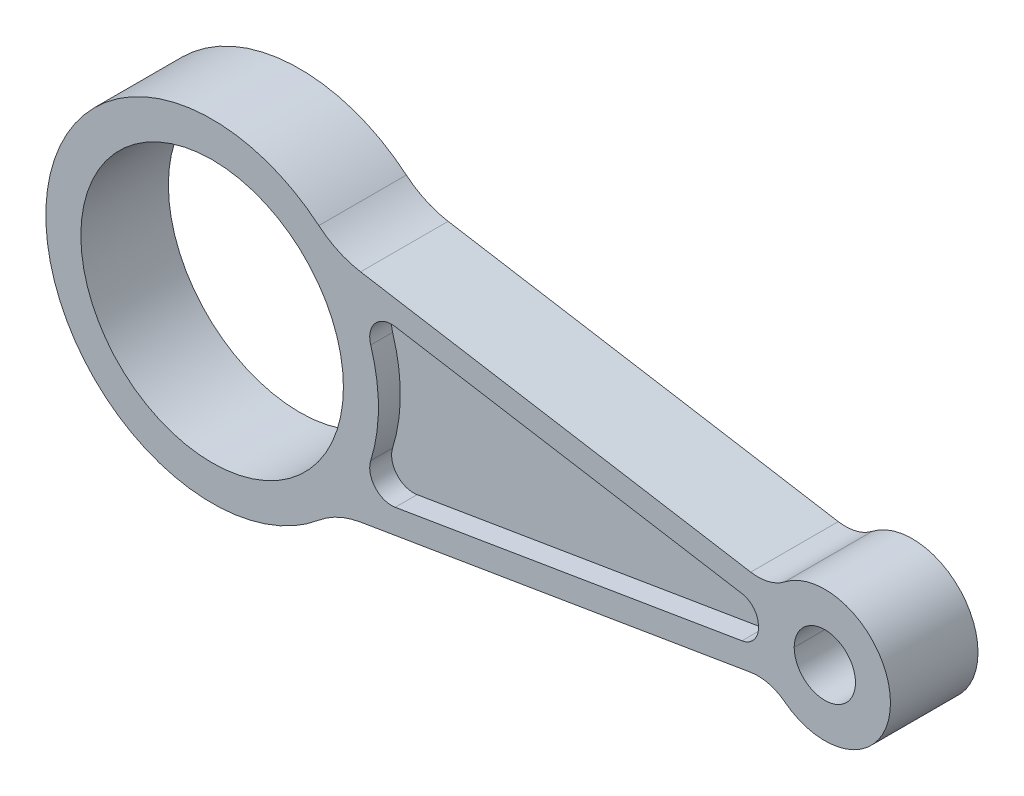
ISO-10303-21;
HEADER;
FILE_DESCRIPTION(('STEP AP214'),'2;1');
FILE_NAME('part.step','',(''),(''),'','','');
FILE_SCHEMA(('AUTOMOTIVE_DESIGN { 1 0 10303 214 1 1 1 1 }'));
ENDSEC;
DATA;
#1=APPLICATION_CONTEXT('core data for automotive mechanical design processes');
#2=APPLICATION_PROTOCOL_DEFINITION('international standard','automotive_design',2000,#1);
#3=PRODUCT_CONTEXT('',#1,'mechanical');
#4=PRODUCT('Part','Part','',(#3));
#5=PRODUCT_RELATED_PRODUCT_CATEGORY('part','',(#4));
#6=PRODUCT_DEFINITION_FORMATION('','',#4);
#7=PRODUCT_DEFINITION_CONTEXT('part definition',#1,'design');
#8=PRODUCT_DEFINITION('design','',#6,#7);
#9=PRODUCT_DEFINITION_SHAPE('','',#8);
#10=(LENGTH_UNIT() NAMED_UNIT(*) SI_UNIT(.MILLI.,.METRE.));
#11=(NAMED_UNIT(*) PLANE_ANGLE_UNIT() SI_UNIT($,.RADIAN.));
#12=(NAMED_UNIT(*) SI_UNIT($,.STERADIAN.) SOLID_ANGLE_UNIT());
#13=UNCERTAINTY_MEASURE_WITH_UNIT(LENGTH_MEASURE(1.E-05),#10,'distance_accuracy_value','');
#14=(GEOMETRIC_REPRESENTATION_CONTEXT(3) GLOBAL_UNCERTAINTY_ASSIGNED_CONTEXT((#13)) GLOBAL_UNIT_ASSIGNED_CONTEXT((#10,
#11,#12)) REPRESENTATION_CONTEXT('',''));
#15=CARTESIAN_POINT('',(0.,0.,0.));
#16=DIRECTION('',(0.,0.,1.));
#17=DIRECTION('',(1.,0.,0.));
#18=AXIS2_PLACEMENT_3D('',#15,#16,#17);
#19=CARTESIAN_POINT('',(140.,0.,-20.));
#20=DIRECTION('',(0.,0.,1.));
#21=DIRECTION('',(1.,0.,0.));
#22=AXIS2_PLACEMENT_3D('',#19,#20,#21);
#23=CYLINDRICAL_SURFACE('',#22,7.00000000000001);
#24=CARTESIAN_POINT('',(140.,0.,-20.));
#25=DIRECTION('',(0.,0.,1.));
#26=DIRECTION('',(1.,0.,0.));
#27=AXIS2_PLACEMENT_3D('',#24,#25,#26);
#28=CIRCLE('',#27,7.00000000000001);
#29=CARTESIAN_POINT('',(133.,0.,-20.));
#30=VERTEX_POINT('',#29);
#31=CARTESIAN_POINT('',(147.,0.,-20.));
#32=VERTEX_POINT('',#31);
#33=EDGE_CURVE('E326',#30,#32,#28,.T.);
#34=ORIENTED_EDGE('',*,*,#33,.F.);
#35=DIRECTION('',(0.,0.,1.));
#36=VECTOR('',#35,1.);
#37=CARTESIAN_POINT('',(133.,0.,-20.));
#38=LINE('',#37,#36);
#39=CARTESIAN_POINT('',(133.,0.,0.));
#40=VERTEX_POINT('',#39);
#41=EDGE_CURVE('E11',#30,#40,#38,.T.);
#42=ORIENTED_EDGE('',*,*,#41,.T.);
#43=CARTESIAN_POINT('',(140.,0.,0.));
#44=DIRECTION('',(0.,0.,1.));
#45=DIRECTION('',(1.,0.,0.));
#46=AXIS2_PLACEMENT_3D('',#43,#44,#45);
#47=CIRCLE('',#46,7.00000000000001);
#48=CARTESIAN_POINT('',(147.,0.,0.));
#49=VERTEX_POINT('',#48);
#50=EDGE_CURVE('E311',#40,#49,#47,.T.);
#51=ORIENTED_EDGE('',*,*,#50,.T.);
#52=DIRECTION('',(0.,0.,-1.));
#53=VECTOR('',#52,1.);
#54=CARTESIAN_POINT('',(147.,0.,-20.));
#55=LINE('',#54,#53);
#56=EDGE_CURVE('E49',#49,#32,#55,.T.);
#57=ORIENTED_EDGE('',*,*,#56,.T.);
#58=EDGE_LOOP('',(#34,#42,#51,#57));
#59=FACE_BOUND('',#58,.T.);
#60=ADVANCED_FACE('F40',(#59),#23,.F.);
#61=CARTESIAN_POINT('',(0.,0.,-20.));
#62=DIRECTION('',(0.,0.,1.));
#63=DIRECTION('',(1.,0.,0.));
#64=AXIS2_PLACEMENT_3D('',#61,#62,#63);
#65=CYLINDRICAL_SURFACE('',#64,38.);
#66=CARTESIAN_POINT('',(0.,0.,0.));
#67=DIRECTION('',(0.,0.,1.));
#68=DIRECTION('',(1.,0.,0.));
#69=AXIS2_PLACEMENT_3D('',#66,#67,#68);
#70=CIRCLE('',#69,38.);
#71=CARTESIAN_POINT('',(24.3781675337846,29.1496989297442,0.));
#72=VERTEX_POINT('',#71);
#73=CARTESIAN_POINT('',(24.3781675337846,-29.1496989297442,0.));
#74=VERTEX_POINT('',#73);
#75=EDGE_CURVE('E336',#72,#74,#70,.T.);
#76=ORIENTED_EDGE('',*,*,#75,.F.);
#77=DIRECTION('',(0.,0.,1.));
#78=VECTOR('',#77,1.);
#79=CARTESIAN_POINT('',(24.3781675337846,29.1496989297442,-20.));
#80=LINE('',#79,#78);
#81=CARTESIAN_POINT('',(24.3781675337846,29.1496989297442,-20.));
#82=VERTEX_POINT('',#81);
#83=EDGE_CURVE('E383',#72,#82,#80,.F.);
#84=ORIENTED_EDGE('',*,*,#83,.T.);
#85=CARTESIAN_POINT('',(0.,0.,-20.));
#86=DIRECTION('',(0.,0.,1.));
#87=DIRECTION('',(1.,0.,0.));
#88=AXIS2_PLACEMENT_3D('',#85,#86,#87);
#89=CIRCLE('',#88,38.);
#90=CARTESIAN_POINT('',(24.3781675337846,-29.1496989297442,-20.));
#91=VERTEX_POINT('',#90);
#92=EDGE_CURVE('E347',#82,#91,#89,.T.);
#93=ORIENTED_EDGE('',*,*,#92,.T.);
#94=DIRECTION('',(0.,0.,1.));
#95=VECTOR('',#94,1.);
#96=CARTESIAN_POINT('',(24.3781675337846,-29.1496989297442,-20.));
#97=LINE('',#96,#95);
#98=EDGE_CURVE('E380',#91,#74,#97,.T.);
#99=ORIENTED_EDGE('',*,*,#98,.T.);
#100=EDGE_LOOP('',(#76,#84,#93,#99));
#101=FACE_BOUND('',#100,.T.);
#102=ADVANCED_FACE('F42',(#101),#65,.T.);
#103=CARTESIAN_POINT('',(27.9354736759495,25.7606154914888,-20.));
#104=DIRECTION('',(0.164285714285714,0.986412795984335,0.));
#105=DIRECTION('',(-0.986412795984335,0.164285714285714,0.));
#106=AXIS2_PLACEMENT_3D('',#103,#104,#105);
#107=PLANE('',#106);
#108=DIRECTION('',(-0.986412795984335,0.164285714285714,0.));
#109=VECTOR('',#108,1.);
#110=CARTESIAN_POINT('',(27.9354736759495,25.7606154914888,-20.));
#111=LINE('',#110,#109);
#112=CARTESIAN_POINT('',(123.068754783715,9.91629645714704,-20.));
#113=VERTEX_POINT('',#112);
#114=CARTESIAN_POINT('',(33.9230677395358,24.7633898151861,-20.));
#115=VERTEX_POINT('',#114);
#116=EDGE_CURVE('E355',#113,#115,#111,.T.);
#117=ORIENTED_EDGE('',*,*,#116,.T.);
#118=DIRECTION('',(0.,0.,-1.));
#119=VECTOR('',#118,1.);
#120=CARTESIAN_POINT('',(33.9230677395358,24.7633898151861,0.));
#121=LINE('',#120,#119);
#122=CARTESIAN_POINT('',(33.9230677395358,24.7633898151861,0.));
#123=VERTEX_POINT('',#122);
#124=EDGE_CURVE('E377',#115,#123,#121,.F.);
#125=ORIENTED_EDGE('',*,*,#124,.T.);
#126=DIRECTION('',(-0.986412795984335,0.164285714285714,0.));
#127=VECTOR('',#126,1.);
#128=CARTESIAN_POINT('',(27.9354736759495,25.7606154914888,0.));
#129=LINE('',#128,#127);
#130=CARTESIAN_POINT('',(123.068754783715,9.91629645714704,0.));
#131=VERTEX_POINT('',#130);
#132=EDGE_CURVE('E344',#131,#123,#129,.T.);
#133=ORIENTED_EDGE('',*,*,#132,.F.);
#134=DIRECTION('',(0.,0.,-1.));
#135=VECTOR('',#134,1.);
#136=CARTESIAN_POINT('',(123.068754783715,9.91629645714704,-20.));
#137=LINE('',#136,#135);
#138=EDGE_CURVE('E363',#131,#113,#137,.T.);
#139=ORIENTED_EDGE('',*,*,#138,.T.);
#140=EDGE_LOOP('',(#117,#125,#133,#139));
#141=FACE_BOUND('',#140,.T.);
#142=ADVANCED_FACE('F421',(#141),#107,.T.);
#143=CARTESIAN_POINT('',(140.,0.,-20.));
#144=DIRECTION('',(0.,0.,1.));
#145=DIRECTION('',(1.,0.,0.));
#146=AXIS2_PLACEMENT_3D('',#143,#144,#145);
#147=CYLINDRICAL_SURFACE('',#146,15.);
#148=CARTESIAN_POINT('',(140.,0.,-20.));
#149=DIRECTION('',(0.,0.,1.));
#150=DIRECTION('',(1.,0.,0.));
#151=AXIS2_PLACEMENT_3D('',#148,#149,#150);
#152=CIRCLE('',#151,15.);
#153=CARTESIAN_POINT('',(130.826967155943,-11.8682546501942,-20.));
#154=VERTEX_POINT('',#153);
#155=CARTESIAN_POINT('',(130.826967155943,11.8682546501942,-20.));
#156=VERTEX_POINT('',#155);
#157=EDGE_CURVE('E352',#154,#156,#152,.T.);
#158=ORIENTED_EDGE('',*,*,#157,.T.);
#159=DIRECTION('',(0.,0.,1.));
#160=VECTOR('',#159,1.);
#161=CARTESIAN_POINT('',(130.826967155943,11.8682546501942,-20.));
#162=LINE('',#161,#160);
#163=CARTESIAN_POINT('',(130.826967155943,11.8682546501942,0.));
#164=VERTEX_POINT('',#163);
#165=EDGE_CURVE('E360',#156,#164,#162,.T.);
#166=ORIENTED_EDGE('',*,*,#165,.T.);
#167=CARTESIAN_POINT('',(140.,0.,0.));
#168=DIRECTION('',(0.,0.,1.));
#169=DIRECTION('',(1.,0.,0.));
#170=AXIS2_PLACEMENT_3D('',#167,#168,#169);
#171=CIRCLE('',#170,15.);
#172=CARTESIAN_POINT('',(130.826967155943,-11.8682546501942,0.));
#173=VERTEX_POINT('',#172);
#174=EDGE_CURVE('E341',#173,#164,#171,.T.);
#175=ORIENTED_EDGE('',*,*,#174,.F.);
#176=DIRECTION('',(0.,0.,1.));
#177=VECTOR('',#176,1.);
#178=CARTESIAN_POINT('',(130.826967155943,-11.8682546501942,-20.));
#179=LINE('',#178,#177);
#180=EDGE_CURVE('E358',#173,#154,#179,.F.);
#181=ORIENTED_EDGE('',*,*,#180,.T.);
#182=EDGE_LOOP('',(#158,#166,#175,#181));
#183=FACE_BOUND('',#182,.T.);
#184=ADVANCED_FACE('F431',(#183),#147,.T.);
#185=CARTESIAN_POINT('',(27.9354736759495,-25.7606154914888,-20.));
#186=DIRECTION('',(0.164285714285714,-0.986412795984335,0.));
#187=DIRECTION('',(0.986412795984335,0.164285714285714,0.));
#188=AXIS2_PLACEMENT_3D('',#185,#186,#187);
#189=PLANE('',#188);
#190=DIRECTION('',(0.986412795984335,0.164285714285714,0.));
#191=VECTOR('',#190,1.);
#192=CARTESIAN_POINT('',(27.9354736759495,-25.7606154914888,0.));
#193=LINE('',#192,#191);
#194=CARTESIAN_POINT('',(33.9230677395358,-24.7633898151861,0.));
#195=VERTEX_POINT('',#194);
#196=CARTESIAN_POINT('',(123.068754783715,-9.91629645714704,0.));
#197=VERTEX_POINT('',#196);
#198=EDGE_CURVE('E339',#195,#197,#193,.T.);
#199=ORIENTED_EDGE('',*,*,#198,.F.);
#200=DIRECTION('',(0.,0.,-1.));
#201=VECTOR('',#200,1.);
#202=CARTESIAN_POINT('',(33.9230677395358,-24.7633898151861,-20.));
#203=LINE('',#202,#201);
#204=CARTESIAN_POINT('',(33.9230677395358,-24.7633898151861,-20.));
#205=VERTEX_POINT('',#204);
#206=EDGE_CURVE('E385',#195,#205,#203,.T.);
#207=ORIENTED_EDGE('',*,*,#206,.T.);
#208=DIRECTION('',(0.986412795984335,0.164285714285714,0.));
#209=VECTOR('',#208,1.);
#210=CARTESIAN_POINT('',(27.9354736759495,-25.7606154914888,-20.));
#211=LINE('',#210,#209);
#212=CARTESIAN_POINT('',(123.068754783715,-9.91629645714704,-20.));
#213=VERTEX_POINT('',#212);
#214=EDGE_CURVE('E350',#205,#213,#211,.T.);
#215=ORIENTED_EDGE('',*,*,#214,.T.);
#216=DIRECTION('',(0.,0.,-1.));
#217=VECTOR('',#216,1.);
#218=CARTESIAN_POINT('',(123.068754783715,-9.91629645714704,0.));
#219=LINE('',#218,#217);
#220=EDGE_CURVE('E365',#213,#197,#219,.F.);
#221=ORIENTED_EDGE('',*,*,#220,.T.);
#222=EDGE_LOOP('',(#199,#207,#215,#221));
#223=FACE_BOUND('',#222,.T.);
#224=ADVANCED_FACE('F404',(#223),#189,.T.);
#225=CARTESIAN_POINT('',(0.,0.,-20.));
#226=DIRECTION('',(0.,0.,1.));
#227=DIRECTION('',(1.,0.,0.));
#228=AXIS2_PLACEMENT_3D('',#225,#226,#227);
#229=PLANE('',#228);
#230=DIRECTION('',(0.986412795984335,-0.164285714285714,0.));
#231=VECTOR('',#230,1.);
#232=CARTESIAN_POINT('',(121.445609230919,4.61087017438385,-20.));
#233=LINE('',#232,#231);
#234=CARTESIAN_POINT('',(41.8285545583335,17.8709827250915,-20.));
#235=VERTEX_POINT('',#234);
#236=CARTESIAN_POINT('',(121.445609230919,4.61087017438385,-20.));
#237=VERTEX_POINT('',#236);
#238=EDGE_CURVE('E215',#235,#237,#233,.T.);
#239=ORIENTED_EDGE('',*,*,#238,.F.);
#240=CARTESIAN_POINT('',(41.0071259869049,12.9389187451698,-20.));
#241=DIRECTION('',(0.,0.,-1.));
#242=DIRECTION('',(1.,0.,0.));
#243=AXIS2_PLACEMENT_3D('',#240,#241,#242);
#244=CIRCLE('',#243,5.);
#245=CARTESIAN_POINT('',(36.2388555233113,11.4343933096849,-20.));
#246=VERTEX_POINT('',#245);
#247=EDGE_CURVE('E219',#246,#235,#244,.T.);
#248=ORIENTED_EDGE('',*,*,#247,.F.);
#249=CARTESIAN_POINT('',(0.,0.,-20.));
#250=DIRECTION('',(0.,0.,1.));
#251=DIRECTION('',(-1.,0.,0.));
#252=AXIS2_PLACEMENT_3D('',#249,#250,#251);
#253=CIRCLE('',#252,38.);
#254=CARTESIAN_POINT('',(36.2388555233113,-11.4343933096849,-20.));
#255=VERTEX_POINT('',#254);
#256=EDGE_CURVE('E236',#255,#246,#253,.T.);
#257=ORIENTED_EDGE('',*,*,#256,.F.);
#258=CARTESIAN_POINT('',(41.0071259869049,-12.9389187451698,-20.));
#259=DIRECTION('',(0.,0.,-1.));
#260=DIRECTION('',(-1.,0.,0.));
#261=AXIS2_PLACEMENT_3D('',#258,#259,#260);
#262=CIRCLE('',#261,5.);
#263=CARTESIAN_POINT('',(41.8285545583335,-17.8709827250915,-20.));
#264=VERTEX_POINT('',#263);
#265=EDGE_CURVE('E233',#264,#255,#262,.T.);
#266=ORIENTED_EDGE('',*,*,#265,.F.);
#267=DIRECTION('',(-0.986412795984335,-0.164285714285714,0.));
#268=VECTOR('',#267,1.);
#269=CARTESIAN_POINT('',(121.433526351168,-4.61288256163042,-20.));
#270=LINE('',#269,#268);
#271=CARTESIAN_POINT('',(121.433526351168,-4.61288256163042,-20.));
#272=VERTEX_POINT('',#271);
#273=EDGE_CURVE('E227',#272,#264,#270,.T.);
#274=ORIENTED_EDGE('',*,*,#273,.F.);
#275=CARTESIAN_POINT('',(120.694240636883,-0.174024979700915,-20.));
#276=DIRECTION('',(0.,0.,-1.));
#277=DIRECTION('',(-1.,0.,0.));
#278=AXIS2_PLACEMENT_3D('',#275,#276,#277);
#279=CIRCLE('',#278,4.5);
#280=CARTESIAN_POINT('',(125.194211833788,-0.157924451151643,-20.));
#281=VERTEX_POINT('',#280);
#282=EDGE_CURVE('E225',#281,#272,#279,.T.);
#283=ORIENTED_EDGE('',*,*,#282,.F.);
#284=CARTESIAN_POINT('',(120.706323516633,0.172012592454348,-20.));
#285=DIRECTION('',(0.,0.,-1.));
#286=DIRECTION('',(1.,0.,0.));
#287=AXIS2_PLACEMENT_3D('',#284,#285,#286);
#288=CIRCLE('',#287,4.5);
#289=EDGE_CURVE('E203',#237,#281,#288,.T.);
#290=ORIENTED_EDGE('',*,*,#289,.F.);
#291=EDGE_LOOP('',(#239,#248,#257,#266,#274,#283,#290));
#292=FACE_BOUND('',#291,.T.);
#293=EDGE_CURVE('E327',#32,#30,#28,.T.);
#294=ORIENTED_EDGE('',*,*,#293,.T.);
#295=ORIENTED_EDGE('',*,*,#33,.T.);
#296=EDGE_LOOP('',(#294,#295));
#297=FACE_BOUND('',#296,.T.);
#298=CARTESIAN_POINT('',(0.,0.,-20.));
#299=DIRECTION('',(0.,0.,1.));
#300=DIRECTION('',(1.,0.,0.));
#301=AXIS2_PLACEMENT_3D('',#298,#299,#300);
#302=CIRCLE('',#301,30.);
#303=CARTESIAN_POINT('',(30.,0.,-20.));
#304=VERTEX_POINT('',#303);
#305=EDGE_CURVE('E333',#304,#304,#302,.T.);
#306=ORIENTED_EDGE('',*,*,#305,.T.);
#307=EDGE_LOOP('',(#306));
#308=FACE_BOUND('',#307,.T.);
#309=ORIENTED_EDGE('',*,*,#92,.F.);
#310=CARTESIAN_POINT('',(37.2087820252501,44.4916457348728,-20.));
#311=DIRECTION('',(0.,0.,1.));
#312=DIRECTION('',(1.,0.,0.));
#313=AXIS2_PLACEMENT_3D('',#310,#311,#312);
#314=CIRCLE('',#313,20.);
#315=EDGE_CURVE('E389',#82,#115,#314,.T.);
#316=ORIENTED_EDGE('',*,*,#315,.T.);
#317=ORIENTED_EDGE('',*,*,#116,.F.);
#318=CARTESIAN_POINT('',(124.711611926572,19.7804244169904,-20.));
#319=DIRECTION('',(0.,0.,1.));
#320=DIRECTION('',(1.,0.,0.));
#321=AXIS2_PLACEMENT_3D('',#318,#319,#320);
#322=CIRCLE('',#321,10.);
#323=EDGE_CURVE('E370',#113,#156,#322,.T.);
#324=ORIENTED_EDGE('',*,*,#323,.T.);
#325=ORIENTED_EDGE('',*,*,#157,.F.);
#326=CARTESIAN_POINT('',(124.711611926572,-19.7804244169904,-20.));
#327=DIRECTION('',(0.,0.,1.));
#328=DIRECTION('',(1.,0.,0.));
#329=AXIS2_PLACEMENT_3D('',#326,#327,#328);
#330=CIRCLE('',#329,10.);
#331=EDGE_CURVE('E374',#154,#213,#330,.T.);
#332=ORIENTED_EDGE('',*,*,#331,.T.);
#333=ORIENTED_EDGE('',*,*,#214,.F.);
#334=CARTESIAN_POINT('',(37.2087820252501,-44.4916457348728,-20.));
#335=DIRECTION('',(0.,0.,1.));
#336=DIRECTION('',(1.,0.,0.));
#337=AXIS2_PLACEMENT_3D('',#334,#335,#336);
#338=CIRCLE('',#337,20.);
#339=EDGE_CURVE('E393',#205,#91,#338,.T.);
#340=ORIENTED_EDGE('',*,*,#339,.T.);
#341=EDGE_LOOP('',(#309,#316,#317,#324,#325,#332,#333,#340));
#342=FACE_BOUND('',#341,.T.);
#343=ADVANCED_FACE('F221',(#292,#297,#308,#342),#229,.F.);
#344=CARTESIAN_POINT('',(0.,0.,0.));
#345=DIRECTION('',(0.,0.,1.));
#346=DIRECTION('',(1.,0.,0.));
#347=AXIS2_PLACEMENT_3D('',#344,#345,#346);
#348=PLANE('',#347);
#349=CARTESIAN_POINT('',(41.0071259869049,12.9389187451698,0.));
#350=DIRECTION('',(0.,0.,1.));
#351=DIRECTION('',(-1.,0.,0.));
#352=AXIS2_PLACEMENT_3D('',#349,#350,#351);
#353=CIRCLE('',#352,5.);
#354=CARTESIAN_POINT('',(41.8285545583335,17.8709827250915,0.));
#355=VERTEX_POINT('',#354);
#356=CARTESIAN_POINT('',(36.2388555233113,11.4343933096849,0.));
#357=VERTEX_POINT('',#356);
#358=EDGE_CURVE('E259',#355,#357,#353,.T.);
#359=ORIENTED_EDGE('',*,*,#358,.F.);
#360=DIRECTION('',(-0.986412795984335,0.164285714285714,0.));
#361=VECTOR('',#360,1.);
#362=CARTESIAN_POINT('',(41.8285545583335,17.8709827250915,0.));
#363=LINE('',#362,#361);
#364=CARTESIAN_POINT('',(121.046940727538,4.67726787330641,0.));
#365=VERTEX_POINT('',#364);
#366=EDGE_CURVE('E284',#365,#355,#363,.T.);
#367=ORIENTED_EDGE('',*,*,#366,.F.);
#368=CARTESIAN_POINT('',(120.307655013253,0.238410291376902,0.));
#369=DIRECTION('',(0.,0.,1.));
#370=DIRECTION('',(1.,0.,0.));
#371=AXIS2_PLACEMENT_3D('',#368,#369,#370);
#372=CIRCLE('',#371,4.5);
#373=CARTESIAN_POINT('',(124.807655013251,0.238406077182834,0.));
#374=VERTEX_POINT('',#373);
#375=EDGE_CURVE('E281',#374,#365,#372,.T.);
#376=ORIENTED_EDGE('',*,*,#375,.F.);
#377=CARTESIAN_POINT('',(120.332548017383,-0.234264395276501,0.));
#378=DIRECTION('',(0.,0.,1.));
#379=DIRECTION('',(-1.,0.,0.));
#380=AXIS2_PLACEMENT_3D('',#377,#378,#379);
#381=CIRCLE('',#380,4.5);
#382=CARTESIAN_POINT('',(121.071833731668,-4.67312197720601,0.));
#383=VERTEX_POINT('',#382);
#384=EDGE_CURVE('E278',#383,#374,#381,.T.);
#385=ORIENTED_EDGE('',*,*,#384,.F.);
#386=DIRECTION('',(0.986412795984335,0.164285714285714,0.));
#387=VECTOR('',#386,1.);
#388=CARTESIAN_POINT('',(41.8285545583335,-17.8709827250915,0.));
#389=LINE('',#388,#387);
#390=CARTESIAN_POINT('',(41.8285545583335,-17.8709827250915,0.));
#391=VERTEX_POINT('',#390);
#392=EDGE_CURVE('E275',#391,#383,#389,.T.);
#393=ORIENTED_EDGE('',*,*,#392,.F.);
#394=CARTESIAN_POINT('',(41.0071259869049,-12.9389187451698,0.));
#395=DIRECTION('',(0.,0.,1.));
#396=DIRECTION('',(-1.,0.,0.));
#397=AXIS2_PLACEMENT_3D('',#394,#395,#396);
#398=CIRCLE('',#397,5.);
#399=CARTESIAN_POINT('',(36.2388555233113,-11.4343933096849,0.));
#400=VERTEX_POINT('',#399);
#401=EDGE_CURVE('E272',#400,#391,#398,.T.);
#402=ORIENTED_EDGE('',*,*,#401,.F.);
#403=CARTESIAN_POINT('',(0.,0.,0.));
#404=DIRECTION('',(0.,0.,-1.));
#405=DIRECTION('',(1.,0.,0.));
#406=AXIS2_PLACEMENT_3D('',#403,#404,#405);
#407=CIRCLE('',#406,38.);
#408=EDGE_CURVE('E269',#357,#400,#407,.T.);
#409=ORIENTED_EDGE('',*,*,#408,.F.);
#410=EDGE_LOOP('',(#359,#367,#376,#385,#393,#402,#409));
#411=FACE_BOUND('',#410,.T.);
#412=EDGE_CURVE('E324',#49,#40,#47,.T.);
#413=ORIENTED_EDGE('',*,*,#412,.F.);
#414=ORIENTED_EDGE('',*,*,#50,.F.);
#415=EDGE_LOOP('',(#413,#414));
#416=FACE_BOUND('',#415,.T.);
#417=CARTESIAN_POINT('',(0.,0.,0.));
#418=DIRECTION('',(0.,0.,1.));
#419=DIRECTION('',(1.,0.,0.));
#420=AXIS2_PLACEMENT_3D('',#417,#418,#419);
#421=CIRCLE('',#420,30.);
#422=CARTESIAN_POINT('',(30.,0.,0.));
#423=VERTEX_POINT('',#422);
#424=EDGE_CURVE('E330',#423,#423,#421,.T.);
#425=ORIENTED_EDGE('',*,*,#424,.F.);
#426=EDGE_LOOP('',(#425));
#427=FACE_BOUND('',#426,.T.);
#428=ORIENTED_EDGE('',*,*,#132,.T.);
#429=CARTESIAN_POINT('',(37.2087820252501,44.4916457348728,0.));
#430=DIRECTION('',(0.,0.,1.));
#431=DIRECTION('',(1.,0.,0.));
#432=AXIS2_PLACEMENT_3D('',#429,#430,#431);
#433=CIRCLE('',#432,20.);
#434=EDGE_CURVE('E387',#123,#72,#433,.F.);
#435=ORIENTED_EDGE('',*,*,#434,.T.);
#436=ORIENTED_EDGE('',*,*,#75,.T.);
#437=CARTESIAN_POINT('',(37.2087820252501,-44.4916457348728,0.));
#438=DIRECTION('',(0.,0.,1.));
#439=DIRECTION('',(1.,0.,0.));
#440=AXIS2_PLACEMENT_3D('',#437,#438,#439);
#441=CIRCLE('',#440,20.);
#442=EDGE_CURVE('E391',#74,#195,#441,.F.);
#443=ORIENTED_EDGE('',*,*,#442,.T.);
#444=ORIENTED_EDGE('',*,*,#198,.T.);
#445=CARTESIAN_POINT('',(124.711611926572,-19.7804244169904,0.));
#446=DIRECTION('',(0.,0.,1.));
#447=DIRECTION('',(1.,0.,0.));
#448=AXIS2_PLACEMENT_3D('',#445,#446,#447);
#449=CIRCLE('',#448,10.);
#450=EDGE_CURVE('E372',#197,#173,#449,.F.);
#451=ORIENTED_EDGE('',*,*,#450,.T.);
#452=ORIENTED_EDGE('',*,*,#174,.T.);
#453=CARTESIAN_POINT('',(124.711611926572,19.7804244169904,0.));
#454=DIRECTION('',(0.,0.,1.));
#455=DIRECTION('',(1.,0.,0.));
#456=AXIS2_PLACEMENT_3D('',#453,#454,#455);
#457=CIRCLE('',#456,10.);
#458=EDGE_CURVE('E368',#164,#131,#457,.F.);
#459=ORIENTED_EDGE('',*,*,#458,.T.);
#460=EDGE_LOOP('',(#428,#435,#436,#443,#444,#451,#452,#459));
#461=FACE_BOUND('',#460,.T.);
#462=ADVANCED_FACE('F403',(#411,#416,#427,#461),#348,.T.);
#463=CARTESIAN_POINT('',(0.,0.,-20.));
#464=DIRECTION('',(0.,0.,1.));
#465=DIRECTION('',(1.,0.,0.));
#466=AXIS2_PLACEMENT_3D('',#463,#464,#465);
#467=CYLINDRICAL_SURFACE('',#466,30.);
#468=ORIENTED_EDGE('',*,*,#305,.F.);
#469=EDGE_LOOP('',(#468));
#470=FACE_BOUND('',#469,.T.);
#471=ORIENTED_EDGE('',*,*,#424,.T.);
#472=EDGE_LOOP('',(#471));
#473=FACE_BOUND('',#472,.T.);
#474=ADVANCED_FACE('F456',(#470,#473),#467,.F.);
#475=ORIENTED_EDGE('',*,*,#41,.F.);
#476=ORIENTED_EDGE('',*,*,#293,.F.);
#477=ORIENTED_EDGE('',*,*,#56,.F.);
#478=ORIENTED_EDGE('',*,*,#412,.T.);
#479=EDGE_LOOP('',(#475,#476,#477,#478));
#480=FACE_BOUND('',#479,.T.);
#481=ADVANCED_FACE('F400',(#480),#23,.F.);
#482=CARTESIAN_POINT('',(124.711611926572,19.7804244169904,-20.));
#483=DIRECTION('',(0.,0.,1.));
#484=DIRECTION('',(1.,0.,0.));
#485=AXIS2_PLACEMENT_3D('',#482,#483,#484);
#486=CYLINDRICAL_SURFACE('',#485,10.);
#487=ORIENTED_EDGE('',*,*,#323,.F.);
#488=ORIENTED_EDGE('',*,*,#138,.F.);
#489=ORIENTED_EDGE('',*,*,#458,.F.);
#490=ORIENTED_EDGE('',*,*,#165,.F.);
#491=EDGE_LOOP('',(#487,#488,#489,#490));
#492=FACE_BOUND('',#491,.T.);
#493=ADVANCED_FACE('F429',(#492),#486,.F.);
#494=CARTESIAN_POINT('',(124.711611926572,-19.7804244169904,-20.));
#495=DIRECTION('',(0.,0.,1.));
#496=DIRECTION('',(1.,0.,0.));
#497=AXIS2_PLACEMENT_3D('',#494,#495,#496);
#498=CYLINDRICAL_SURFACE('',#497,10.);
#499=ORIENTED_EDGE('',*,*,#331,.F.);
#500=ORIENTED_EDGE('',*,*,#180,.F.);
#501=ORIENTED_EDGE('',*,*,#450,.F.);
#502=ORIENTED_EDGE('',*,*,#220,.F.);
#503=EDGE_LOOP('',(#499,#500,#501,#502));
#504=FACE_BOUND('',#503,.T.);
#505=ADVANCED_FACE('F437',(#504),#498,.F.);
#506=CARTESIAN_POINT('',(37.2087820252501,44.4916457348728,-20.));
#507=DIRECTION('',(0.,0.,1.));
#508=DIRECTION('',(1.,0.,0.));
#509=AXIS2_PLACEMENT_3D('',#506,#507,#508);
#510=CYLINDRICAL_SURFACE('',#509,20.);
#511=ORIENTED_EDGE('',*,*,#315,.F.);
#512=ORIENTED_EDGE('',*,*,#83,.F.);
#513=ORIENTED_EDGE('',*,*,#434,.F.);
#514=ORIENTED_EDGE('',*,*,#124,.F.);
#515=EDGE_LOOP('',(#511,#512,#513,#514));
#516=FACE_BOUND('',#515,.T.);
#517=ADVANCED_FACE('F418',(#516),#510,.F.);
#518=CARTESIAN_POINT('',(37.2087820252501,-44.4916457348728,-20.));
#519=DIRECTION('',(0.,0.,1.));
#520=DIRECTION('',(1.,0.,0.));
#521=AXIS2_PLACEMENT_3D('',#518,#519,#520);
#522=CYLINDRICAL_SURFACE('',#521,20.);
#523=ORIENTED_EDGE('',*,*,#339,.F.);
#524=ORIENTED_EDGE('',*,*,#206,.F.);
#525=ORIENTED_EDGE('',*,*,#442,.F.);
#526=ORIENTED_EDGE('',*,*,#98,.F.);
#527=EDGE_LOOP('',(#523,#524,#525,#526));
#528=FACE_BOUND('',#527,.T.);
#529=ADVANCED_FACE('F443',(#528),#522,.F.);
#530=CARTESIAN_POINT('',(41.0071259869049,12.9389187451698,-5.));
#531=DIRECTION('',(0.,0.,1.));
#532=DIRECTION('',(1.,0.,0.));
#533=AXIS2_PLACEMENT_3D('',#530,#531,#532);
#534=CYLINDRICAL_SURFACE('',#533,5.);
#535=ORIENTED_EDGE('',*,*,#358,.T.);
#536=DIRECTION('',(0.,0.,1.));
#537=VECTOR('',#536,1.);
#538=CARTESIAN_POINT('',(36.2388555233113,11.4343933096849,-5.));
#539=LINE('',#538,#537);
#540=CARTESIAN_POINT('',(36.2388555233113,11.4343933096849,-5.));
#541=VERTEX_POINT('',#540);
#542=EDGE_CURVE('E308',#541,#357,#539,.T.);
#543=ORIENTED_EDGE('',*,*,#542,.F.);
#544=CARTESIAN_POINT('',(41.0071259869049,12.9389187451698,-5.));
#545=DIRECTION('',(0.,0.,1.));
#546=DIRECTION('',(-1.,0.,0.));
#547=AXIS2_PLACEMENT_3D('',#544,#545,#546);
#548=CIRCLE('',#547,5.);
#549=CARTESIAN_POINT('',(41.8285545583335,17.8709827250915,-5.));
#550=VERTEX_POINT('',#549);
#551=EDGE_CURVE('E287',#550,#541,#548,.T.);
#552=ORIENTED_EDGE('',*,*,#551,.F.);
#553=DIRECTION('',(0.,0.,1.));
#554=VECTOR('',#553,1.);
#555=CARTESIAN_POINT('',(41.8285545583335,17.8709827250915,-5.));
#556=LINE('',#555,#554);
#557=EDGE_CURVE('E309',#550,#355,#556,.T.);
#558=ORIENTED_EDGE('',*,*,#557,.T.);
#559=EDGE_LOOP('',(#535,#543,#552,#558));
#560=FACE_BOUND('',#559,.T.);
#561=ADVANCED_FACE('F646',(#560),#534,.F.);
#562=CARTESIAN_POINT('',(41.8285545583335,17.8709827250915,-5.));
#563=DIRECTION('',(0.164285714285714,0.986412795984335,0.));
#564=DIRECTION('',(-0.986412795984335,0.164285714285714,0.));
#565=AXIS2_PLACEMENT_3D('',#562,#563,#564);
#566=PLANE('',#565);
#567=ORIENTED_EDGE('',*,*,#366,.T.);
#568=ORIENTED_EDGE('',*,*,#557,.F.);
#569=DIRECTION('',(-0.986412795984335,0.164285714285714,0.));
#570=VECTOR('',#569,1.);
#571=CARTESIAN_POINT('',(41.8285545583335,17.8709827250915,-5.));
#572=LINE('',#571,#570);
#573=CARTESIAN_POINT('',(121.046940727538,4.67726787330641,-5.));
#574=VERTEX_POINT('',#573);
#575=EDGE_CURVE('E305',#574,#550,#572,.T.);
#576=ORIENTED_EDGE('',*,*,#575,.F.);
#577=DIRECTION('',(0.,0.,1.));
#578=VECTOR('',#577,1.);
#579=CARTESIAN_POINT('',(121.046940727538,4.67726787330641,-5.));
#580=LINE('',#579,#578);
#581=EDGE_CURVE('E312',#574,#365,#580,.T.);
#582=ORIENTED_EDGE('',*,*,#581,.T.);
#583=EDGE_LOOP('',(#567,#568,#576,#582));
#584=FACE_BOUND('',#583,.T.);
#585=ADVANCED_FACE('F636',(#584),#566,.F.);
#586=CARTESIAN_POINT('',(120.307655013253,0.238410291376902,-5.));
#587=DIRECTION('',(0.,0.,1.));
#588=DIRECTION('',(1.,0.,0.));
#589=AXIS2_PLACEMENT_3D('',#586,#587,#588);
#590=CYLINDRICAL_SURFACE('',#589,4.5);
#591=ORIENTED_EDGE('',*,*,#375,.T.);
#592=ORIENTED_EDGE('',*,*,#581,.F.);
#593=CARTESIAN_POINT('',(120.307655013253,0.238410291376902,-5.));
#594=DIRECTION('',(0.,0.,1.));
#595=DIRECTION('',(1.,0.,0.));
#596=AXIS2_PLACEMENT_3D('',#593,#594,#595);
#597=CIRCLE('',#596,4.5);
#598=CARTESIAN_POINT('',(124.807655013251,0.238406077182834,-5.));
#599=VERTEX_POINT('',#598);
#600=EDGE_CURVE('E302',#599,#574,#597,.T.);
#601=ORIENTED_EDGE('',*,*,#600,.F.);
#602=DIRECTION('',(0.,0.,1.));
#603=VECTOR('',#602,1.);
#604=CARTESIAN_POINT('',(124.807655013251,0.238406077182834,-5.));
#605=LINE('',#604,#603);
#606=EDGE_CURVE('E314',#599,#374,#605,.T.);
#607=ORIENTED_EDGE('',*,*,#606,.T.);
#608=EDGE_LOOP('',(#591,#592,#601,#607));
#609=FACE_BOUND('',#608,.T.);
#610=ADVANCED_FACE('F626',(#609),#590,.F.);
#611=CARTESIAN_POINT('',(120.332548017383,-0.234264395276501,-5.));
#612=DIRECTION('',(0.,0.,1.));
#613=DIRECTION('',(1.,0.,0.));
#614=AXIS2_PLACEMENT_3D('',#611,#612,#613);
#615=CYLINDRICAL_SURFACE('',#614,4.5);
#616=ORIENTED_EDGE('',*,*,#384,.T.);
#617=ORIENTED_EDGE('',*,*,#606,.F.);
#618=CARTESIAN_POINT('',(120.332548017383,-0.234264395276501,-5.));
#619=DIRECTION('',(0.,0.,1.));
#620=DIRECTION('',(-1.,0.,0.));
#621=AXIS2_PLACEMENT_3D('',#618,#619,#620);
#622=CIRCLE('',#621,4.5);
#623=CARTESIAN_POINT('',(121.071833731668,-4.67312197720601,-5.));
#624=VERTEX_POINT('',#623);
#625=EDGE_CURVE('E299',#624,#599,#622,.T.);
#626=ORIENTED_EDGE('',*,*,#625,.F.);
#627=DIRECTION('',(0.,0.,1.));
#628=VECTOR('',#627,1.);
#629=CARTESIAN_POINT('',(121.071833731668,-4.67312197720601,-5.));
#630=LINE('',#629,#628);
#631=EDGE_CURVE('E316',#624,#383,#630,.T.);
#632=ORIENTED_EDGE('',*,*,#631,.T.);
#633=EDGE_LOOP('',(#616,#617,#626,#632));
#634=FACE_BOUND('',#633,.T.);
#635=ADVANCED_FACE('F616',(#634),#615,.F.);
#636=CARTESIAN_POINT('',(41.8285545583335,-17.8709827250915,-5.));
#637=DIRECTION('',(0.164285714285714,-0.986412795984335,0.));
#638=DIRECTION('',(0.986412795984335,0.164285714285714,0.));
#639=AXIS2_PLACEMENT_3D('',#636,#637,#638);
#640=PLANE('',#639);
#641=ORIENTED_EDGE('',*,*,#392,.T.);
#642=ORIENTED_EDGE('',*,*,#631,.F.);
#643=DIRECTION('',(0.986412795984335,0.164285714285714,0.));
#644=VECTOR('',#643,1.);
#645=CARTESIAN_POINT('',(41.8285545583335,-17.8709827250915,-5.));
#646=LINE('',#645,#644);
#647=CARTESIAN_POINT('',(41.8285545583335,-17.8709827250915,-5.));
#648=VERTEX_POINT('',#647);
#649=EDGE_CURVE('E296',#648,#624,#646,.T.);
#650=ORIENTED_EDGE('',*,*,#649,.F.);
#651=DIRECTION('',(0.,0.,1.));
#652=VECTOR('',#651,1.);
#653=CARTESIAN_POINT('',(41.8285545583335,-17.8709827250915,-5.));
#654=LINE('',#653,#652);
#655=EDGE_CURVE('E318',#648,#391,#654,.T.);
#656=ORIENTED_EDGE('',*,*,#655,.T.);
#657=EDGE_LOOP('',(#641,#642,#650,#656));
#658=FACE_BOUND('',#657,.T.);
#659=ADVANCED_FACE('F606',(#658),#640,.F.);
#660=CARTESIAN_POINT('',(41.0071259869049,-12.9389187451698,-5.));
#661=DIRECTION('',(0.,0.,1.));
#662=DIRECTION('',(1.,0.,0.));
#663=AXIS2_PLACEMENT_3D('',#660,#661,#662);
#664=CYLINDRICAL_SURFACE('',#663,5.);
#665=ORIENTED_EDGE('',*,*,#401,.T.);
#666=ORIENTED_EDGE('',*,*,#655,.F.);
#667=CARTESIAN_POINT('',(41.0071259869049,-12.9389187451698,-5.));
#668=DIRECTION('',(0.,0.,1.));
#669=DIRECTION('',(-1.,0.,0.));
#670=AXIS2_PLACEMENT_3D('',#667,#668,#669);
#671=CIRCLE('',#670,5.);
#672=CARTESIAN_POINT('',(36.2388555233113,-11.4343933096849,-5.));
#673=VERTEX_POINT('',#672);
#674=EDGE_CURVE('E293',#673,#648,#671,.T.);
#675=ORIENTED_EDGE('',*,*,#674,.F.);
#676=DIRECTION('',(0.,0.,1.));
#677=VECTOR('',#676,1.);
#678=CARTESIAN_POINT('',(36.2388555233113,-11.4343933096849,-5.));
#679=LINE('',#678,#677);
#680=EDGE_CURVE('E320',#673,#400,#679,.T.);
#681=ORIENTED_EDGE('',*,*,#680,.T.);
#682=EDGE_LOOP('',(#665,#666,#675,#681));
#683=FACE_BOUND('',#682,.T.);
#684=ADVANCED_FACE('F596',(#683),#664,.F.);
#685=CARTESIAN_POINT('',(0.,0.,-5.));
#686=DIRECTION('',(0.,0.,1.));
#687=DIRECTION('',(1.,0.,0.));
#688=AXIS2_PLACEMENT_3D('',#685,#686,#687);
#689=CYLINDRICAL_SURFACE('',#688,38.);
#690=ORIENTED_EDGE('',*,*,#408,.T.);
#691=ORIENTED_EDGE('',*,*,#680,.F.);
#692=CARTESIAN_POINT('',(0.,0.,-5.));
#693=DIRECTION('',(0.,0.,-1.));
#694=DIRECTION('',(1.,0.,0.));
#695=AXIS2_PLACEMENT_3D('',#692,#693,#694);
#696=CIRCLE('',#695,38.);
#697=EDGE_CURVE('E290',#541,#673,#696,.T.);
#698=ORIENTED_EDGE('',*,*,#697,.F.);
#699=ORIENTED_EDGE('',*,*,#542,.T.);
#700=EDGE_LOOP('',(#690,#691,#698,#699));
#701=FACE_BOUND('',#700,.T.);
#702=ADVANCED_FACE('F586',(#701),#689,.T.);
#703=CARTESIAN_POINT('',(41.0071259869049,12.9389187451698,-5.));
#704=DIRECTION('',(0.,0.,-1.));
#705=DIRECTION('',(-1.,0.,0.));
#706=AXIS2_PLACEMENT_3D('',#703,#704,#705);
#707=PLANE('',#706);
#708=ORIENTED_EDGE('',*,*,#551,.T.);
#709=ORIENTED_EDGE('',*,*,#697,.T.);
#710=ORIENTED_EDGE('',*,*,#674,.T.);
#711=ORIENTED_EDGE('',*,*,#649,.T.);
#712=ORIENTED_EDGE('',*,*,#625,.T.);
#713=ORIENTED_EDGE('',*,*,#600,.T.);
#714=ORIENTED_EDGE('',*,*,#575,.T.);
#715=EDGE_LOOP('',(#708,#709,#710,#711,#712,#713,#714));
#716=FACE_BOUND('',#715,.T.);
#717=ADVANCED_FACE('F576',(#716),#707,.F.);
#718=CARTESIAN_POINT('',(41.0071259869049,12.9389187451698,-15.));
#719=DIRECTION('',(0.,0.,-1.));
#720=DIRECTION('',(-1.,0.,0.));
#721=AXIS2_PLACEMENT_3D('',#718,#719,#720);
#722=CYLINDRICAL_SURFACE('',#721,5.);
#723=ORIENTED_EDGE('',*,*,#247,.T.);
#724=DIRECTION('',(0.,0.,-1.));
#725=VECTOR('',#724,1.);
#726=CARTESIAN_POINT('',(41.8285545583335,17.8709827250915,-15.));
#727=LINE('',#726,#725);
#728=CARTESIAN_POINT('',(41.8285545583335,17.8709827250915,-15.));
#729=VERTEX_POINT('',#728);
#730=EDGE_CURVE('E211',#729,#235,#727,.T.);
#731=ORIENTED_EDGE('',*,*,#730,.F.);
#732=CARTESIAN_POINT('',(41.0071259869049,12.9389187451698,-15.));
#733=DIRECTION('',(0.,0.,-1.));
#734=DIRECTION('',(1.,0.,0.));
#735=AXIS2_PLACEMENT_3D('',#732,#733,#734);
#736=CIRCLE('',#735,5.);
#737=CARTESIAN_POINT('',(36.2388555233113,11.4343933096849,-15.));
#738=VERTEX_POINT('',#737);
#739=EDGE_CURVE('E239',#738,#729,#736,.T.);
#740=ORIENTED_EDGE('',*,*,#739,.F.);
#741=DIRECTION('',(0.,0.,-1.));
#742=VECTOR('',#741,1.);
#743=CARTESIAN_POINT('',(36.2388555233113,11.4343933096849,-15.));
#744=LINE('',#743,#742);
#745=EDGE_CURVE('E257',#738,#246,#744,.T.);
#746=ORIENTED_EDGE('',*,*,#745,.T.);
#747=EDGE_LOOP('',(#723,#731,#740,#746));
#748=FACE_BOUND('',#747,.T.);
#749=ADVANCED_FACE('F566',(#748),#722,.F.);
#750=CARTESIAN_POINT('',(0.,0.,-15.));
#751=DIRECTION('',(0.,0.,-1.));
#752=DIRECTION('',(-1.,0.,0.));
#753=AXIS2_PLACEMENT_3D('',#750,#751,#752);
#754=CYLINDRICAL_SURFACE('',#753,38.);
#755=ORIENTED_EDGE('',*,*,#256,.T.);
#756=ORIENTED_EDGE('',*,*,#745,.F.);
#757=CARTESIAN_POINT('',(0.,0.,-15.));
#758=DIRECTION('',(0.,0.,1.));
#759=DIRECTION('',(-1.,0.,0.));
#760=AXIS2_PLACEMENT_3D('',#757,#758,#759);
#761=CIRCLE('',#760,38.);
#762=CARTESIAN_POINT('',(36.2388555233113,-11.4343933096849,-15.));
#763=VERTEX_POINT('',#762);
#764=EDGE_CURVE('E254',#763,#738,#761,.T.);
#765=ORIENTED_EDGE('',*,*,#764,.F.);
#766=DIRECTION('',(0.,0.,-1.));
#767=VECTOR('',#766,1.);
#768=CARTESIAN_POINT('',(36.2388555233113,-11.4343933096849,-15.));
#769=LINE('',#768,#767);
#770=EDGE_CURVE('E260',#763,#255,#769,.T.);
#771=ORIENTED_EDGE('',*,*,#770,.T.);
#772=EDGE_LOOP('',(#755,#756,#765,#771));
#773=FACE_BOUND('',#772,.T.);
#774=ADVANCED_FACE('F556',(#773),#754,.T.);
#775=CARTESIAN_POINT('',(41.0071259869049,-12.9389187451698,-15.));
#776=DIRECTION('',(0.,0.,-1.));
#777=DIRECTION('',(-1.,0.,0.));
#778=AXIS2_PLACEMENT_3D('',#775,#776,#777);
#779=CYLINDRICAL_SURFACE('',#778,5.);
#780=ORIENTED_EDGE('',*,*,#265,.T.);
#781=ORIENTED_EDGE('',*,*,#770,.F.);
#782=CARTESIAN_POINT('',(41.0071259869049,-12.9389187451698,-15.));
#783=DIRECTION('',(0.,0.,-1.));
#784=DIRECTION('',(-1.,0.,0.));
#785=AXIS2_PLACEMENT_3D('',#782,#783,#784);
#786=CIRCLE('',#785,5.);
#787=CARTESIAN_POINT('',(41.8285545583335,-17.8709827250915,-15.));
#788=VERTEX_POINT('',#787);
#789=EDGE_CURVE('E251',#788,#763,#786,.T.);
#790=ORIENTED_EDGE('',*,*,#789,.F.);
#791=DIRECTION('',(0.,0.,-1.));
#792=VECTOR('',#791,1.);
#793=CARTESIAN_POINT('',(41.8285545583335,-17.8709827250915,-15.));
#794=LINE('',#793,#792);
#795=EDGE_CURVE('E262',#788,#264,#794,.T.);
#796=ORIENTED_EDGE('',*,*,#795,.T.);
#797=EDGE_LOOP('',(#780,#781,#790,#796));
#798=FACE_BOUND('',#797,.T.);
#799=ADVANCED_FACE('F546',(#798),#779,.F.);
#800=CARTESIAN_POINT('',(121.433526351168,-4.61288256163042,-15.));
#801=DIRECTION('',(0.164285714285714,-0.986412795984335,0.));
#802=DIRECTION('',(0.986412795984335,0.164285714285714,0.));
#803=AXIS2_PLACEMENT_3D('',#800,#801,#802);
#804=PLANE('',#803);
#805=ORIENTED_EDGE('',*,*,#273,.T.);
#806=ORIENTED_EDGE('',*,*,#795,.F.);
#807=DIRECTION('',(-0.986412795984335,-0.164285714285714,0.));
#808=VECTOR('',#807,1.);
#809=CARTESIAN_POINT('',(121.433526351168,-4.61288256163042,-15.));
#810=LINE('',#809,#808);
#811=CARTESIAN_POINT('',(121.433526351168,-4.61288256163042,-15.));
#812=VERTEX_POINT('',#811);
#813=EDGE_CURVE('E248',#812,#788,#810,.T.);
#814=ORIENTED_EDGE('',*,*,#813,.F.);
#815=DIRECTION('',(0.,0.,-1.));
#816=VECTOR('',#815,1.);
#817=CARTESIAN_POINT('',(121.433526351168,-4.61288256163042,-15.));
#818=LINE('',#817,#816);
#819=EDGE_CURVE('E264',#812,#272,#818,.T.);
#820=ORIENTED_EDGE('',*,*,#819,.T.);
#821=EDGE_LOOP('',(#805,#806,#814,#820));
#822=FACE_BOUND('',#821,.T.);
#823=ADVANCED_FACE('F536',(#822),#804,.F.);
#824=CARTESIAN_POINT('',(120.694240636883,-0.174024979700915,-15.));
#825=DIRECTION('',(0.,0.,-1.));
#826=DIRECTION('',(-1.,0.,0.));
#827=AXIS2_PLACEMENT_3D('',#824,#825,#826);
#828=CYLINDRICAL_SURFACE('',#827,4.5);
#829=ORIENTED_EDGE('',*,*,#282,.T.);
#830=ORIENTED_EDGE('',*,*,#819,.F.);
#831=CARTESIAN_POINT('',(120.694240636883,-0.174024979700915,-15.));
#832=DIRECTION('',(0.,0.,-1.));
#833=DIRECTION('',(-1.,0.,0.));
#834=AXIS2_PLACEMENT_3D('',#831,#832,#833);
#835=CIRCLE('',#834,4.5);
#836=CARTESIAN_POINT('',(125.194211833788,-0.157924451151643,-15.));
#837=VERTEX_POINT('',#836);
#838=EDGE_CURVE('E245',#837,#812,#835,.T.);
#839=ORIENTED_EDGE('',*,*,#838,.F.);
#840=DIRECTION('',(0.,0.,-1.));
#841=VECTOR('',#840,1.);
#842=CARTESIAN_POINT('',(125.194211833788,-0.157924451151643,-15.));
#843=LINE('',#842,#841);
#844=EDGE_CURVE('E210',#837,#281,#843,.T.);
#845=ORIENTED_EDGE('',*,*,#844,.T.);
#846=EDGE_LOOP('',(#829,#830,#839,#845));
#847=FACE_BOUND('',#846,.T.);
#848=ADVANCED_FACE('F527',(#847),#828,.F.);
#849=CARTESIAN_POINT('',(120.706323516633,0.172012592454348,-15.));
#850=DIRECTION('',(0.,0.,-1.));
#851=DIRECTION('',(-1.,0.,0.));
#852=AXIS2_PLACEMENT_3D('',#849,#850,#851);
#853=CYLINDRICAL_SURFACE('',#852,4.5);
#854=ORIENTED_EDGE('',*,*,#289,.T.);
#855=ORIENTED_EDGE('',*,*,#844,.F.);
#856=CARTESIAN_POINT('',(120.706323516633,0.172012592454348,-15.));
#857=DIRECTION('',(0.,0.,-1.));
#858=DIRECTION('',(1.,0.,0.));
#859=AXIS2_PLACEMENT_3D('',#856,#857,#858);
#860=CIRCLE('',#859,4.5);
#861=CARTESIAN_POINT('',(121.445609230919,4.61087017438385,-15.));
#862=VERTEX_POINT('',#861);
#863=EDGE_CURVE('E206',#862,#837,#860,.T.);
#864=ORIENTED_EDGE('',*,*,#863,.F.);
#865=DIRECTION('',(0.,0.,-1.));
#866=VECTOR('',#865,1.);
#867=CARTESIAN_POINT('',(121.445609230919,4.61087017438385,-15.));
#868=LINE('',#867,#866);
#869=EDGE_CURVE('E199',#862,#237,#868,.T.);
#870=ORIENTED_EDGE('',*,*,#869,.T.);
#871=EDGE_LOOP('',(#854,#855,#864,#870));
#872=FACE_BOUND('',#871,.T.);
#873=ADVANCED_FACE('F201',(#872),#853,.F.);
#874=CARTESIAN_POINT('',(121.445609230919,4.61087017438385,-15.));
#875=DIRECTION('',(0.164285714285714,0.986412795984335,0.));
#876=DIRECTION('',(-0.986412795984335,0.164285714285714,0.));
#877=AXIS2_PLACEMENT_3D('',#874,#875,#876);
#878=PLANE('',#877);
#879=ORIENTED_EDGE('',*,*,#238,.T.);
#880=ORIENTED_EDGE('',*,*,#869,.F.);
#881=DIRECTION('',(0.986412795984335,-0.164285714285714,0.));
#882=VECTOR('',#881,1.);
#883=CARTESIAN_POINT('',(121.445609230919,4.61087017438385,-15.));
#884=LINE('',#883,#882);
#885=EDGE_CURVE('E242',#729,#862,#884,.T.);
#886=ORIENTED_EDGE('',*,*,#885,.F.);
#887=ORIENTED_EDGE('',*,*,#730,.T.);
#888=EDGE_LOOP('',(#879,#880,#886,#887));
#889=FACE_BOUND('',#888,.T.);
#890=ADVANCED_FACE('F216',(#889),#878,.F.);
#891=CARTESIAN_POINT('',(41.0071259869049,12.9389187451698,-15.));
#892=DIRECTION('',(0.,0.,1.));
#893=DIRECTION('',(1.,0.,0.));
#894=AXIS2_PLACEMENT_3D('',#891,#892,#893);
#895=PLANE('',#894);
#896=ORIENTED_EDGE('',*,*,#739,.T.);
#897=ORIENTED_EDGE('',*,*,#885,.T.);
#898=ORIENTED_EDGE('',*,*,#863,.T.);
#899=ORIENTED_EDGE('',*,*,#838,.T.);
#900=ORIENTED_EDGE('',*,*,#813,.T.);
#901=ORIENTED_EDGE('',*,*,#789,.T.);
#902=ORIENTED_EDGE('',*,*,#764,.T.);
#903=EDGE_LOOP('',(#896,#897,#898,#899,#900,#901,#902));
#904=FACE_BOUND('',#903,.T.);
#905=ADVANCED_FACE('F506',(#904),#895,.F.);
#906=CLOSED_SHELL('',(#60,#102,#142,#184,#224,#343,#462,#474,#481,#493,#505,#517,#529,#561,#585,
#610,#635,#659,#684,#702,#717,#749,#774,#799,#823,#848,#873,#890,#905));
#907=MANIFOLD_SOLID_BREP('B2',#906);
#908=ADVANCED_BREP_SHAPE_REPRESENTATION('',(#18,#907),#14);
#909=SHAPE_DEFINITION_REPRESENTATION(#9,#908);
ENDSEC;
END-ISO-10303-21;
